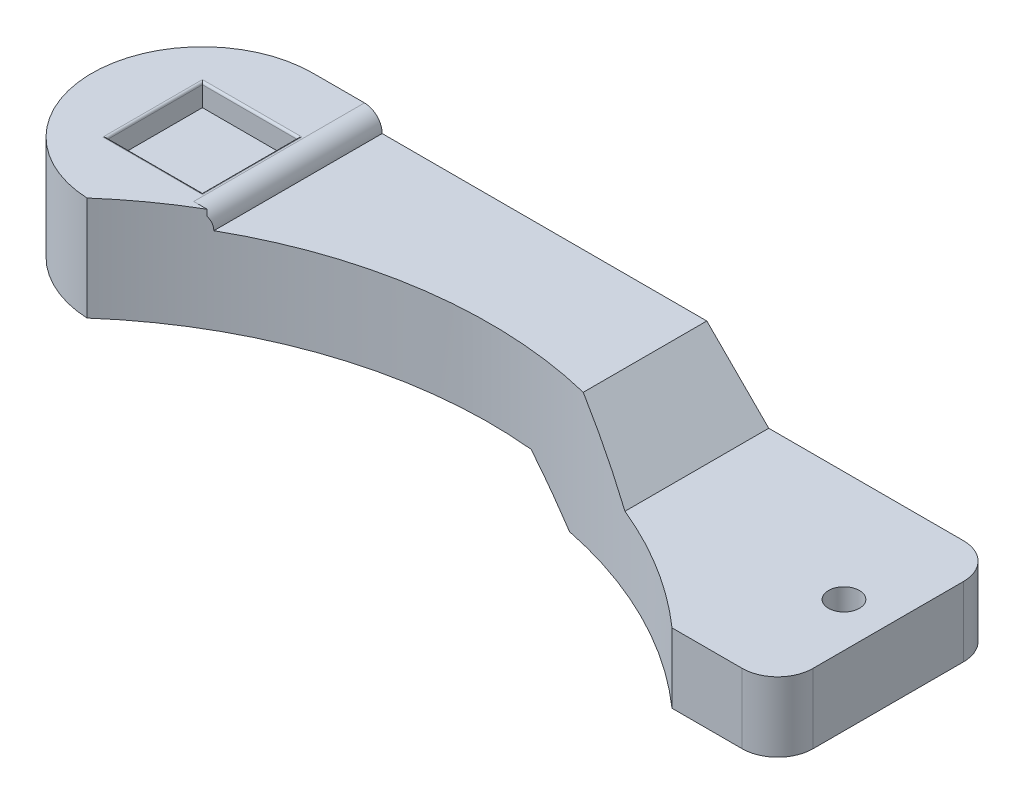
ISO-10303-21;
HEADER;
FILE_DESCRIPTION(('STEP AP214'),'2;1');
FILE_NAME('part.step','',(''),(''),'','','');
FILE_SCHEMA(('AUTOMOTIVE_DESIGN { 1 0 10303 214 1 1 1 1 }'));
ENDSEC;
DATA;
#1=APPLICATION_CONTEXT('core data for automotive mechanical design processes');
#2=APPLICATION_PROTOCOL_DEFINITION('international standard','automotive_design',2000,#1);
#3=PRODUCT_CONTEXT('',#1,'mechanical');
#4=PRODUCT('Part','Part','',(#3));
#5=PRODUCT_RELATED_PRODUCT_CATEGORY('part','',(#4));
#6=PRODUCT_DEFINITION_FORMATION('','',#4);
#7=PRODUCT_DEFINITION_CONTEXT('part definition',#1,'design');
#8=PRODUCT_DEFINITION('design','',#6,#7);
#9=PRODUCT_DEFINITION_SHAPE('','',#8);
#10=(LENGTH_UNIT() NAMED_UNIT(*) SI_UNIT(.MILLI.,.METRE.));
#11=(NAMED_UNIT(*) PLANE_ANGLE_UNIT() SI_UNIT($,.RADIAN.));
#12=(NAMED_UNIT(*) SI_UNIT($,.STERADIAN.) SOLID_ANGLE_UNIT());
#13=UNCERTAINTY_MEASURE_WITH_UNIT(LENGTH_MEASURE(1.E-05),#10,'distance_accuracy_value','');
#14=(GEOMETRIC_REPRESENTATION_CONTEXT(3) GLOBAL_UNCERTAINTY_ASSIGNED_CONTEXT((#13)) GLOBAL_UNIT_ASSIGNED_CONTEXT((#10,
#11,#12)) REPRESENTATION_CONTEXT('',''));
#15=CARTESIAN_POINT('',(0.,0.,0.));
#16=DIRECTION('',(0.,0.,1.));
#17=DIRECTION('',(1.,0.,0.));
#18=AXIS2_PLACEMENT_3D('',#15,#16,#17);
#19=CARTESIAN_POINT('',(-32.5,16.87,0.));
#20=DIRECTION('',(0.,-1.,0.));
#21=DIRECTION('',(0.,0.,-1.));
#22=AXIS2_PLACEMENT_3D('',#19,#20,#21);
#23=CYLINDRICAL_SURFACE('',#22,12.5);
#24=DIRECTION('',(0.,1.,0.));
#25=VECTOR('',#24,1.);
#26=CARTESIAN_POINT('',(-33.0577685669235,8.434994,12.4875495685003));
#27=LINE('',#26,#25);
#28=CARTESIAN_POINT('',(-33.0577685669235,16.87,12.4875495685003));
#29=VERTEX_POINT('',#28);
#30=CARTESIAN_POINT('',(-33.0577685669235,5.12,12.4875495685003));
#31=VERTEX_POINT('',#30);
#32=EDGE_CURVE('E498',#29,#31,#27,.F.);
#33=ORIENTED_EDGE('',*,*,#32,.F.);
#34=CARTESIAN_POINT('',(-32.5,16.87,0.));
#35=DIRECTION('',(0.,1.,0.));
#36=DIRECTION('',(0.,0.,1.));
#37=AXIS2_PLACEMENT_3D('',#34,#35,#36);
#38=CIRCLE('',#37,12.5);
#39=CARTESIAN_POINT('',(-32.5,16.87,-12.5));
#40=VERTEX_POINT('',#39);
#41=EDGE_CURVE('E227',#40,#29,#38,.T.);
#42=ORIENTED_EDGE('',*,*,#41,.F.);
#43=DIRECTION('',(0.,-1.,0.));
#44=VECTOR('',#43,1.);
#45=CARTESIAN_POINT('',(-32.5,16.87,-12.5));
#46=LINE('',#45,#44);
#47=CARTESIAN_POINT('',(-32.5,5.12,-12.5));
#48=VERTEX_POINT('',#47);
#49=EDGE_CURVE('E224',#48,#40,#46,.F.);
#50=ORIENTED_EDGE('',*,*,#49,.F.);
#51=CARTESIAN_POINT('',(-32.5,5.12,0.));
#52=DIRECTION('',(0.,1.,0.));
#53=DIRECTION('',(-1.,0.,0.));
#54=AXIS2_PLACEMENT_3D('',#51,#52,#53);
#55=CIRCLE('',#54,12.5);
#56=EDGE_CURVE('E229',#31,#48,#55,.F.);
#57=ORIENTED_EDGE('',*,*,#56,.F.);
#58=EDGE_LOOP('',(#33,#42,#50,#57));
#59=FACE_BOUND('',#58,.T.);
#60=ADVANCED_FACE('F39',(#59),#23,.T.);
#61=CARTESIAN_POINT('',(-45.,16.87,12.5));
#62=DIRECTION('',(0.,0.,-1.));
#63=DIRECTION('',(-1.,0.,0.));
#64=AXIS2_PLACEMENT_3D('',#61,#62,#63);
#65=PLANE('',#64);
#66=DIRECTION('',(-1.,0.,0.));
#67=VECTOR('',#66,1.);
#68=CARTESIAN_POINT('',(0.,7.87,12.5));
#69=LINE('',#68,#67);
#70=CARTESIAN_POINT('',(41.,7.87,12.5));
#71=VERTEX_POINT('',#70);
#72=CARTESIAN_POINT('',(33.0718913883074,7.87,12.5));
#73=VERTEX_POINT('',#72);
#74=EDGE_CURVE('E235',#71,#73,#69,.T.);
#75=ORIENTED_EDGE('',*,*,#74,.T.);
#76=DIRECTION('',(0.,1.,0.));
#77=VECTOR('',#76,1.);
#78=CARTESIAN_POINT('',(33.0718913883074,-1.2E-05,12.5));
#79=LINE('',#78,#77);
#80=CARTESIAN_POINT('',(33.0718913883074,0.,12.5));
#81=VERTEX_POINT('',#80);
#82=EDGE_CURVE('E194',#73,#81,#79,.F.);
#83=ORIENTED_EDGE('',*,*,#82,.T.);
#84=DIRECTION('',(1.,0.,0.));
#85=VECTOR('',#84,1.);
#86=CARTESIAN_POINT('',(-45.,0.,12.5));
#87=LINE('',#86,#85);
#88=CARTESIAN_POINT('',(41.,0.,12.5));
#89=VERTEX_POINT('',#88);
#90=EDGE_CURVE('E193',#81,#89,#87,.T.);
#91=ORIENTED_EDGE('',*,*,#90,.T.);
#92=DIRECTION('',(0.,-1.,0.));
#93=VECTOR('',#92,1.);
#94=CARTESIAN_POINT('',(41.,16.87,12.5));
#95=LINE('',#94,#93);
#96=EDGE_CURVE('E252',#89,#71,#95,.F.);
#97=ORIENTED_EDGE('',*,*,#96,.T.);
#98=EDGE_LOOP('',(#75,#83,#91,#97));
#99=FACE_BOUND('',#98,.T.);
#100=ADVANCED_FACE('F372',(#99),#65,.F.);
#101=CARTESIAN_POINT('',(45.,16.87,-12.5));
#102=DIRECTION('',(-1.,0.,0.));
#103=DIRECTION('',(0.,0.,1.));
#104=AXIS2_PLACEMENT_3D('',#101,#102,#103);
#105=PLANE('',#104);
#106=DIRECTION('',(0.,0.,-1.));
#107=VECTOR('',#106,1.);
#108=CARTESIAN_POINT('',(45.,0.,-12.5));
#109=LINE('',#108,#107);
#110=CARTESIAN_POINT('',(45.,0.,8.5));
#111=VERTEX_POINT('',#110);
#112=CARTESIAN_POINT('',(45.,0.,-8.5));
#113=VERTEX_POINT('',#112);
#114=EDGE_CURVE('E211',#111,#113,#109,.T.);
#115=ORIENTED_EDGE('',*,*,#114,.T.);
#116=DIRECTION('',(0.,-1.,0.));
#117=VECTOR('',#116,1.);
#118=CARTESIAN_POINT('',(45.,16.87,-8.5));
#119=LINE('',#118,#117);
#120=CARTESIAN_POINT('',(45.,7.87,-8.5));
#121=VERTEX_POINT('',#120);
#122=EDGE_CURVE('E246',#113,#121,#119,.F.);
#123=ORIENTED_EDGE('',*,*,#122,.T.);
#124=DIRECTION('',(0.,0.,1.));
#125=VECTOR('',#124,1.);
#126=CARTESIAN_POINT('',(45.,7.87,-21.5));
#127=LINE('',#126,#125);
#128=CARTESIAN_POINT('',(45.,7.87,8.5));
#129=VERTEX_POINT('',#128);
#130=EDGE_CURVE('E397',#121,#129,#127,.T.);
#131=ORIENTED_EDGE('',*,*,#130,.T.);
#132=DIRECTION('',(0.,-1.,0.));
#133=VECTOR('',#132,1.);
#134=CARTESIAN_POINT('',(45.,16.87,8.5));
#135=LINE('',#134,#133);
#136=EDGE_CURVE('E243',#129,#111,#135,.T.);
#137=ORIENTED_EDGE('',*,*,#136,.T.);
#138=EDGE_LOOP('',(#115,#123,#131,#137));
#139=FACE_BOUND('',#138,.T.);
#140=ADVANCED_FACE('F368',(#139),#105,.F.);
#141=CARTESIAN_POINT('',(-45.,16.87,-12.5));
#142=DIRECTION('',(0.,0.,1.));
#143=DIRECTION('',(1.,0.,0.));
#144=AXIS2_PLACEMENT_3D('',#141,#142,#143);
#145=PLANE('',#144);
#146=DIRECTION('',(-1.,0.,0.));
#147=VECTOR('',#146,1.);
#148=CARTESIAN_POINT('',(-45.,16.87,-12.5));
#149=LINE('',#148,#147);
#150=CARTESIAN_POINT('',(-26.6881108387509,16.87,-12.5));
#151=VERTEX_POINT('',#150);
#152=EDGE_CURVE('E201',#151,#40,#149,.T.);
#153=ORIENTED_EDGE('',*,*,#152,.F.);
#154=CARTESIAN_POINT('',(-26.6881108387509,14.87,-12.5));
#155=DIRECTION('',(0.,0.,1.));
#156=DIRECTION('',(1.,0.,0.));
#157=AXIS2_PLACEMENT_3D('',#154,#155,#156);
#158=CIRCLE('',#157,2.);
#159=CARTESIAN_POINT('',(-24.6881108387509,14.87,-12.5));
#160=VERTEX_POINT('',#159);
#161=EDGE_CURVE('E258',#151,#160,#158,.F.);
#162=ORIENTED_EDGE('',*,*,#161,.T.);
#163=DIRECTION('',(-1.,0.,0.));
#164=VECTOR('',#163,1.);
#165=CARTESIAN_POINT('',(-45.,14.87,-12.5));
#166=LINE('',#165,#164);
#167=CARTESIAN_POINT('',(12.,14.87,-12.5));
#168=VERTEX_POINT('',#167);
#169=EDGE_CURVE('E469',#168,#160,#166,.T.);
#170=ORIENTED_EDGE('',*,*,#169,.F.);
#171=DIRECTION('',(0.707106781186551,-0.707106781186544,0.));
#172=VECTOR('',#171,1.);
#173=CARTESIAN_POINT('',(-17.5000000000003,44.37,-12.5));
#174=LINE('',#173,#172);
#175=CARTESIAN_POINT('',(19.0000000000001,7.87,-12.5));
#176=VERTEX_POINT('',#175);
#177=EDGE_CURVE('E410',#168,#176,#174,.T.);
#178=ORIENTED_EDGE('',*,*,#177,.T.);
#179=DIRECTION('',(-1.,0.,0.));
#180=VECTOR('',#179,1.);
#181=CARTESIAN_POINT('',(-45.,7.86999999999999,-12.5));
#182=LINE('',#181,#180);
#183=CARTESIAN_POINT('',(41.,7.87,-12.5));
#184=VERTEX_POINT('',#183);
#185=EDGE_CURVE('E200',#184,#176,#182,.T.);
#186=ORIENTED_EDGE('',*,*,#185,.F.);
#187=DIRECTION('',(0.,-1.,0.));
#188=VECTOR('',#187,1.);
#189=CARTESIAN_POINT('',(41.,16.87,-12.5));
#190=LINE('',#189,#188);
#191=CARTESIAN_POINT('',(41.,0.,-12.5));
#192=VERTEX_POINT('',#191);
#193=EDGE_CURVE('E231',#184,#192,#190,.T.);
#194=ORIENTED_EDGE('',*,*,#193,.T.);
#195=DIRECTION('',(-1.,0.,0.));
#196=VECTOR('',#195,1.);
#197=CARTESIAN_POINT('',(-45.,0.,-12.5));
#198=LINE('',#197,#196);
#199=CARTESIAN_POINT('',(9.99999999999998,0.,-12.5));
#200=VERTEX_POINT('',#199);
#201=EDGE_CURVE('E205',#192,#200,#198,.T.);
#202=ORIENTED_EDGE('',*,*,#201,.T.);
#203=DIRECTION('',(-0.707106781186551,0.707106781186544,0.));
#204=VECTOR('',#203,1.);
#205=CARTESIAN_POINT('',(-25.9350000000003,35.9349999999999,-12.5));
#206=LINE('',#205,#204);
#207=CARTESIAN_POINT('',(4.87999999999994,5.12,-12.5));
#208=VERTEX_POINT('',#207);
#209=EDGE_CURVE('E199',#200,#208,#206,.T.);
#210=ORIENTED_EDGE('',*,*,#209,.T.);
#211=DIRECTION('',(-1.,0.,0.));
#212=VECTOR('',#211,1.);
#213=CARTESIAN_POINT('',(-45.,5.11999999999999,-12.5));
#214=LINE('',#213,#212);
#215=EDGE_CURVE('E203',#208,#48,#214,.T.);
#216=ORIENTED_EDGE('',*,*,#215,.T.);
#217=ORIENTED_EDGE('',*,*,#49,.T.);
#218=EDGE_LOOP('',(#153,#162,#170,#178,#186,#194,#202,#210,#216,#217));
#219=FACE_BOUND('',#218,.T.);
#220=ADVANCED_FACE('F362',(#219),#145,.F.);
#221=CARTESIAN_POINT('',(0.,16.87,0.));
#222=DIRECTION('',(0.,1.,0.));
#223=DIRECTION('',(0.,0.,1.));
#224=AXIS2_PLACEMENT_3D('',#221,#222,#223);
#225=PLANE('',#224);
#226=CARTESIAN_POINT('',(0.,16.87,50.));
#227=DIRECTION('',(0.,1.,0.));
#228=DIRECTION('',(0.,0.,1.));
#229=AXIS2_PLACEMENT_3D('',#226,#227,#228);
#230=CIRCLE('',#229,50.);
#231=CARTESIAN_POINT('',(-25.1677794209933,16.87,6.79603167513168));
#232=VERTEX_POINT('',#231);
#233=EDGE_CURVE('E506',#232,#29,#230,.T.);
#234=ORIENTED_EDGE('',*,*,#233,.F.);
#235=DIRECTION('',(1.,0.,0.));
#236=VECTOR('',#235,1.);
#237=CARTESIAN_POINT('',(-24.6881108387509,16.87,6.79603167513168));
#238=LINE('',#237,#236);
#239=CARTESIAN_POINT('',(-26.6881108387509,16.87,6.79603167513168));
#240=VERTEX_POINT('',#239);
#241=EDGE_CURVE('E289',#240,#232,#238,.T.);
#242=ORIENTED_EDGE('',*,*,#241,.F.);
#243=DIRECTION('',(0.,0.,1.));
#244=VECTOR('',#243,1.);
#245=CARTESIAN_POINT('',(-26.6881108387509,16.87,-12.5));
#246=LINE('',#245,#244);
#247=EDGE_CURVE('E256',#240,#151,#246,.F.);
#248=ORIENTED_EDGE('',*,*,#247,.T.);
#249=ORIENTED_EDGE('',*,*,#152,.T.);
#250=ORIENTED_EDGE('',*,*,#41,.T.);
#251=EDGE_LOOP('',(#234,#242,#248,#249,#250));
#252=FACE_BOUND('',#251,.T.);
#253=DIRECTION('',(1.,0.,0.));
#254=VECTOR('',#253,1.);
#255=CARTESIAN_POINT('',(-37.875,16.87,5.62500000000001));
#256=LINE('',#255,#254);
#257=CARTESIAN_POINT('',(-26.875,16.87,5.625));
#258=VERTEX_POINT('',#257);
#259=CARTESIAN_POINT('',(-38.125,16.87,5.62500000000001));
#260=VERTEX_POINT('',#259);
#261=EDGE_CURVE('E269',#258,#260,#256,.F.);
#262=ORIENTED_EDGE('',*,*,#261,.T.);
#263=DIRECTION('',(0.,0.,1.));
#264=VECTOR('',#263,1.);
#265=CARTESIAN_POINT('',(-38.125,16.87,-5.375));
#266=LINE('',#265,#264);
#267=CARTESIAN_POINT('',(-38.125,16.87,-5.625));
#268=VERTEX_POINT('',#267);
#269=EDGE_CURVE('E272',#260,#268,#266,.F.);
#270=ORIENTED_EDGE('',*,*,#269,.T.);
#271=DIRECTION('',(-1.,0.,0.));
#272=VECTOR('',#271,1.);
#273=CARTESIAN_POINT('',(-27.125,16.87,-5.625));
#274=LINE('',#273,#272);
#275=CARTESIAN_POINT('',(-26.875,16.87,-5.625));
#276=VERTEX_POINT('',#275);
#277=EDGE_CURVE('E267',#268,#276,#274,.F.);
#278=ORIENTED_EDGE('',*,*,#277,.T.);
#279=DIRECTION('',(0.,0.,-1.));
#280=VECTOR('',#279,1.);
#281=CARTESIAN_POINT('',(-26.875,16.87,5.375));
#282=LINE('',#281,#280);
#283=EDGE_CURVE('E265',#276,#258,#282,.F.);
#284=ORIENTED_EDGE('',*,*,#283,.T.);
#285=EDGE_LOOP('',(#262,#270,#278,#284));
#286=FACE_BOUND('',#285,.T.);
#287=ADVANCED_FACE('F359',(#252,#286),#225,.T.);
#288=CARTESIAN_POINT('',(0.,0.,0.));
#289=DIRECTION('',(0.,1.,0.));
#290=DIRECTION('',(0.,0.,1.));
#291=AXIS2_PLACEMENT_3D('',#288,#289,#290);
#292=PLANE('',#291);
#293=CARTESIAN_POINT('',(40.,0.,0.));
#294=DIRECTION('',(0.,-1.,0.));
#295=DIRECTION('',(0.,0.,-1.));
#296=AXIS2_PLACEMENT_3D('',#293,#294,#295);
#297=CIRCLE('',#296,1.75);
#298=CARTESIAN_POINT('',(40.,0.,-1.75));
#299=VERTEX_POINT('',#298);
#300=EDGE_CURVE('E236',#299,#299,#297,.T.);
#301=ORIENTED_EDGE('',*,*,#300,.F.);
#302=EDGE_LOOP('',(#301));
#303=FACE_BOUND('',#302,.T.);
#304=ORIENTED_EDGE('',*,*,#90,.F.);
#305=CARTESIAN_POINT('',(0.,0.,50.));
#306=DIRECTION('',(0.,1.,0.));
#307=DIRECTION('',(0.,0.,1.));
#308=AXIS2_PLACEMENT_3D('',#305,#306,#307);
#309=CIRCLE('',#308,50.);
#310=CARTESIAN_POINT('',(10.0000029767738,-2.97677381794094E-06,1.01020667289797));
#311=VERTEX_POINT('',#310);
#312=EDGE_CURVE('E178',#81,#311,#309,.T.);
#313=ORIENTED_EDGE('',*,*,#312,.T.);
#314=DIRECTION('',(0.,0.,-1.));
#315=VECTOR('',#314,1.);
#316=CARTESIAN_POINT('',(9.99999999999999,0.,0.));
#317=LINE('',#316,#315);
#318=EDGE_CURVE('E43',#311,#200,#317,.T.);
#319=ORIENTED_EDGE('',*,*,#318,.T.);
#320=ORIENTED_EDGE('',*,*,#201,.F.);
#321=CARTESIAN_POINT('',(41.,0.,-8.5));
#322=DIRECTION('',(0.,1.,0.));
#323=DIRECTION('',(0.,0.,1.));
#324=AXIS2_PLACEMENT_3D('',#321,#322,#323);
#325=CIRCLE('',#324,4.);
#326=EDGE_CURVE('E241',#192,#113,#325,.F.);
#327=ORIENTED_EDGE('',*,*,#326,.T.);
#328=ORIENTED_EDGE('',*,*,#114,.F.);
#329=CARTESIAN_POINT('',(41.,0.,8.5));
#330=DIRECTION('',(0.,1.,0.));
#331=DIRECTION('',(0.,0.,1.));
#332=AXIS2_PLACEMENT_3D('',#329,#330,#331);
#333=CIRCLE('',#332,4.);
#334=EDGE_CURVE('E239',#111,#89,#333,.F.);
#335=ORIENTED_EDGE('',*,*,#334,.T.);
#336=EDGE_LOOP('',(#304,#313,#319,#320,#327,#328,#335));
#337=FACE_BOUND('',#336,.T.);
#338=ADVANCED_FACE('F189',(#303,#337),#292,.F.);
#339=CARTESIAN_POINT('',(-37.875,14.37,-5.375));
#340=DIRECTION('',(-1.,0.,0.));
#341=DIRECTION('',(0.,0.,1.));
#342=AXIS2_PLACEMENT_3D('',#339,#340,#341);
#343=PLANE('',#342);
#344=DIRECTION('',(0.,1.,0.));
#345=VECTOR('',#344,1.);
#346=CARTESIAN_POINT('',(-37.875,14.37,-5.375));
#347=LINE('',#346,#345);
#348=CARTESIAN_POINT('',(-37.875,14.37,-5.375));
#349=VERTEX_POINT('',#348);
#350=CARTESIAN_POINT('',(-37.875,16.62,-5.375));
#351=VERTEX_POINT('',#350);
#352=EDGE_CURVE('E218',#349,#351,#347,.T.);
#353=ORIENTED_EDGE('',*,*,#352,.T.);
#354=DIRECTION('',(0.,0.,1.));
#355=VECTOR('',#354,1.);
#356=CARTESIAN_POINT('',(-37.875,16.62,5.375));
#357=LINE('',#356,#355);
#358=CARTESIAN_POINT('',(-37.875,16.62,5.375));
#359=VERTEX_POINT('',#358);
#360=EDGE_CURVE('E276',#351,#359,#357,.T.);
#361=ORIENTED_EDGE('',*,*,#360,.T.);
#362=DIRECTION('',(0.,1.,0.));
#363=VECTOR('',#362,1.);
#364=CARTESIAN_POINT('',(-37.875,14.37,5.375));
#365=LINE('',#364,#363);
#366=CARTESIAN_POINT('',(-37.875,14.37,5.375));
#367=VERTEX_POINT('',#366);
#368=EDGE_CURVE('E215',#367,#359,#365,.T.);
#369=ORIENTED_EDGE('',*,*,#368,.F.);
#370=DIRECTION('',(0.,0.,1.));
#371=VECTOR('',#370,1.);
#372=CARTESIAN_POINT('',(-37.875,14.37,-5.375));
#373=LINE('',#372,#371);
#374=EDGE_CURVE('E412',#349,#367,#373,.T.);
#375=ORIENTED_EDGE('',*,*,#374,.F.);
#376=EDGE_LOOP('',(#353,#361,#369,#375));
#377=FACE_BOUND('',#376,.T.);
#378=ADVANCED_FACE('F349',(#377),#343,.F.);
#379=CARTESIAN_POINT('',(-37.875,14.37,-5.375));
#380=DIRECTION('',(0.,0.,-1.));
#381=DIRECTION('',(-1.,0.,0.));
#382=AXIS2_PLACEMENT_3D('',#379,#380,#381);
#383=PLANE('',#382);
#384=DIRECTION('',(0.,1.,0.));
#385=VECTOR('',#384,1.);
#386=CARTESIAN_POINT('',(-27.125,14.37,-5.375));
#387=LINE('',#386,#385);
#388=CARTESIAN_POINT('',(-27.125,14.37,-5.375));
#389=VERTEX_POINT('',#388);
#390=CARTESIAN_POINT('',(-27.125,16.62,-5.375));
#391=VERTEX_POINT('',#390);
#392=EDGE_CURVE('E426',#389,#391,#387,.T.);
#393=ORIENTED_EDGE('',*,*,#392,.T.);
#394=DIRECTION('',(-1.,0.,0.));
#395=VECTOR('',#394,1.);
#396=CARTESIAN_POINT('',(-37.875,16.62,-5.375));
#397=LINE('',#396,#395);
#398=EDGE_CURVE('E274',#391,#351,#397,.T.);
#399=ORIENTED_EDGE('',*,*,#398,.T.);
#400=ORIENTED_EDGE('',*,*,#352,.F.);
#401=DIRECTION('',(-1.,0.,0.));
#402=VECTOR('',#401,1.);
#403=CARTESIAN_POINT('',(-37.875,14.37,-5.375));
#404=LINE('',#403,#402);
#405=EDGE_CURVE('E421',#389,#349,#404,.T.);
#406=ORIENTED_EDGE('',*,*,#405,.F.);
#407=EDGE_LOOP('',(#393,#399,#400,#406));
#408=FACE_BOUND('',#407,.T.);
#409=ADVANCED_FACE('F345',(#408),#383,.F.);
#410=CARTESIAN_POINT('',(-27.125,14.37,-5.375));
#411=DIRECTION('',(1.,0.,0.));
#412=DIRECTION('',(0.,0.,-1.));
#413=AXIS2_PLACEMENT_3D('',#410,#411,#412);
#414=PLANE('',#413);
#415=DIRECTION('',(0.,1.,0.));
#416=VECTOR('',#415,1.);
#417=CARTESIAN_POINT('',(-27.125,14.37,5.375));
#418=LINE('',#417,#416);
#419=CARTESIAN_POINT('',(-27.125,14.37,5.375));
#420=VERTEX_POINT('',#419);
#421=CARTESIAN_POINT('',(-27.125,16.62,5.375));
#422=VERTEX_POINT('',#421);
#423=EDGE_CURVE('E427',#420,#422,#418,.T.);
#424=ORIENTED_EDGE('',*,*,#423,.T.);
#425=DIRECTION('',(0.,0.,-1.));
#426=VECTOR('',#425,1.);
#427=CARTESIAN_POINT('',(-27.125,16.62,-5.375));
#428=LINE('',#427,#426);
#429=EDGE_CURVE('E49',#422,#391,#428,.T.);
#430=ORIENTED_EDGE('',*,*,#429,.T.);
#431=ORIENTED_EDGE('',*,*,#392,.F.);
#432=DIRECTION('',(0.,0.,-1.));
#433=VECTOR('',#432,1.);
#434=CARTESIAN_POINT('',(-27.125,14.37,-5.375));
#435=LINE('',#434,#433);
#436=EDGE_CURVE('E418',#420,#389,#435,.T.);
#437=ORIENTED_EDGE('',*,*,#436,.F.);
#438=EDGE_LOOP('',(#424,#430,#431,#437));
#439=FACE_BOUND('',#438,.T.);
#440=ADVANCED_FACE('F348',(#439),#414,.F.);
#441=CARTESIAN_POINT('',(-37.875,14.37,5.375));
#442=DIRECTION('',(0.,0.,1.));
#443=DIRECTION('',(1.,0.,0.));
#444=AXIS2_PLACEMENT_3D('',#441,#442,#443);
#445=PLANE('',#444);
#446=ORIENTED_EDGE('',*,*,#368,.T.);
#447=DIRECTION('',(1.,0.,0.));
#448=VECTOR('',#447,1.);
#449=CARTESIAN_POINT('',(-27.125,16.62,5.375));
#450=LINE('',#449,#448);
#451=EDGE_CURVE('E262',#359,#422,#450,.T.);
#452=ORIENTED_EDGE('',*,*,#451,.T.);
#453=ORIENTED_EDGE('',*,*,#423,.F.);
#454=DIRECTION('',(1.,0.,0.));
#455=VECTOR('',#454,1.);
#456=CARTESIAN_POINT('',(-37.875,14.37,5.375));
#457=LINE('',#456,#455);
#458=EDGE_CURVE('E415',#367,#420,#457,.T.);
#459=ORIENTED_EDGE('',*,*,#458,.F.);
#460=EDGE_LOOP('',(#446,#452,#453,#459));
#461=FACE_BOUND('',#460,.T.);
#462=ADVANCED_FACE('F343',(#461),#445,.F.);
#463=CARTESIAN_POINT('',(0.,14.37,0.));
#464=DIRECTION('',(0.,1.,0.));
#465=DIRECTION('',(0.,0.,1.));
#466=AXIS2_PLACEMENT_3D('',#463,#464,#465);
#467=PLANE('',#466);
#468=ORIENTED_EDGE('',*,*,#374,.T.);
#469=ORIENTED_EDGE('',*,*,#458,.T.);
#470=ORIENTED_EDGE('',*,*,#436,.T.);
#471=ORIENTED_EDGE('',*,*,#405,.T.);
#472=EDGE_LOOP('',(#468,#469,#470,#471));
#473=FACE_BOUND('',#472,.T.);
#474=ADVANCED_FACE('F330',(#473),#467,.T.);
#475=CARTESIAN_POINT('',(0.,5.12,-21.5));
#476=DIRECTION('',(0.,1.,0.));
#477=DIRECTION('',(-1.,0.,0.));
#478=AXIS2_PLACEMENT_3D('',#475,#476,#477);
#479=PLANE('',#478);
#480=CARTESIAN_POINT('',(-32.5,5.11999999999999,0.));
#481=DIRECTION('',(0.,-1.,0.));
#482=DIRECTION('',(1.,0.,0.));
#483=AXIS2_PLACEMENT_3D('',#480,#481,#482);
#484=CIRCLE('',#483,6.45);
#485=CARTESIAN_POINT('',(-26.05,5.11999999999999,0.));
#486=VERTEX_POINT('',#485);
#487=EDGE_CURVE('E475',#486,#486,#484,.T.);
#488=ORIENTED_EDGE('',*,*,#487,.F.);
#489=EDGE_LOOP('',(#488));
#490=FACE_BOUND('',#489,.T.);
#491=DIRECTION('',(0.,0.,1.));
#492=VECTOR('',#491,1.);
#493=CARTESIAN_POINT('',(4.87999999999994,5.12,-21.5));
#494=LINE('',#493,#492);
#495=CARTESIAN_POINT('',(4.87999999999994,5.12,0.238713842988323));
#496=VERTEX_POINT('',#495);
#497=EDGE_CURVE('E405',#208,#496,#494,.T.);
#498=ORIENTED_EDGE('',*,*,#497,.T.);
#499=CARTESIAN_POINT('',(0.,5.12,50.));
#500=DIRECTION('',(0.,1.,0.));
#501=DIRECTION('',(-1.,0.,0.));
#502=AXIS2_PLACEMENT_3D('',#499,#500,#501);
#503=CIRCLE('',#502,50.);
#504=EDGE_CURVE('E181',#496,#31,#503,.T.);
#505=ORIENTED_EDGE('',*,*,#504,.T.);
#506=ORIENTED_EDGE('',*,*,#56,.T.);
#507=ORIENTED_EDGE('',*,*,#215,.F.);
#508=EDGE_LOOP('',(#498,#505,#506,#507));
#509=FACE_BOUND('',#508,.T.);
#510=ADVANCED_FACE('F327',(#490,#509),#479,.F.);
#511=CARTESIAN_POINT('',(4.99999999999994,5.,-21.5));
#512=DIRECTION('',(0.707106781186544,0.707106781186551,0.));
#513=DIRECTION('',(-0.707106781186551,0.707106781186544,0.));
#514=AXIS2_PLACEMENT_3D('',#511,#512,#513);
#515=PLANE('',#514);
#516=ORIENTED_EDGE('',*,*,#318,.F.);
#517=CARTESIAN_POINT('',(0.,9.99999999999989,50.));
#518=DIRECTION('',(0.707106781186544,0.707106781186551,0.));
#519=DIRECTION('',(-0.707106781186551,0.707106781186544,0.));
#520=AXIS2_PLACEMENT_3D('',#517,#518,#519);
#521=ELLIPSE('',#520,70.7106781186544,50.);
#522=EDGE_CURVE('E175',#311,#496,#521,.T.);
#523=ORIENTED_EDGE('',*,*,#522,.T.);
#524=ORIENTED_EDGE('',*,*,#497,.F.);
#525=ORIENTED_EDGE('',*,*,#209,.F.);
#526=EDGE_LOOP('',(#516,#523,#524,#525));
#527=FACE_BOUND('',#526,.T.);
#528=ADVANCED_FACE('F197',(#527),#515,.F.);
#529=CARTESIAN_POINT('',(0.,7.87,-21.5));
#530=DIRECTION('',(0.,1.,0.));
#531=DIRECTION('',(-1.,0.,0.));
#532=AXIS2_PLACEMENT_3D('',#529,#530,#531);
#533=PLANE('',#532);
#534=CARTESIAN_POINT('',(0.,7.87,50.));
#535=DIRECTION('',(0.,1.,0.));
#536=DIRECTION('',(-1.,0.,0.));
#537=AXIS2_PLACEMENT_3D('',#534,#535,#536);
#538=CIRCLE('',#537,50.);
#539=CARTESIAN_POINT('',(19.0000000000001,7.87,3.75067568061134));
#540=VERTEX_POINT('',#539);
#541=EDGE_CURVE('E488',#73,#540,#538,.T.);
#542=ORIENTED_EDGE('',*,*,#541,.F.);
#543=ORIENTED_EDGE('',*,*,#74,.F.);
#544=CARTESIAN_POINT('',(41.,7.87,8.5));
#545=DIRECTION('',(0.,1.,0.));
#546=DIRECTION('',(-1.,0.,0.));
#547=AXIS2_PLACEMENT_3D('',#544,#545,#546);
#548=CIRCLE('',#547,4.);
#549=EDGE_CURVE('E248',#71,#129,#548,.T.);
#550=ORIENTED_EDGE('',*,*,#549,.T.);
#551=ORIENTED_EDGE('',*,*,#130,.F.);
#552=CARTESIAN_POINT('',(41.,7.87,-8.5));
#553=DIRECTION('',(0.,1.,0.));
#554=DIRECTION('',(-1.,0.,0.));
#555=AXIS2_PLACEMENT_3D('',#552,#553,#554);
#556=CIRCLE('',#555,4.);
#557=EDGE_CURVE('E250',#121,#184,#556,.T.);
#558=ORIENTED_EDGE('',*,*,#557,.T.);
#559=ORIENTED_EDGE('',*,*,#185,.T.);
#560=DIRECTION('',(0.,0.,1.));
#561=VECTOR('',#560,1.);
#562=CARTESIAN_POINT('',(19.0000000000001,7.87,-21.5));
#563=LINE('',#562,#561);
#564=EDGE_CURVE('E402',#176,#540,#563,.T.);
#565=ORIENTED_EDGE('',*,*,#564,.T.);
#566=EDGE_LOOP('',(#542,#543,#550,#551,#558,#559,#565));
#567=FACE_BOUND('',#566,.T.);
#568=CARTESIAN_POINT('',(40.,7.87,0.));
#569=DIRECTION('',(0.,1.,0.));
#570=DIRECTION('',(-1.,0.,0.));
#571=AXIS2_PLACEMENT_3D('',#568,#569,#570);
#572=CIRCLE('',#571,1.75);
#573=CARTESIAN_POINT('',(38.25,7.87,0.));
#574=VERTEX_POINT('',#573);
#575=EDGE_CURVE('E232',#574,#574,#572,.T.);
#576=ORIENTED_EDGE('',*,*,#575,.F.);
#577=EDGE_LOOP('',(#576));
#578=FACE_BOUND('',#577,.T.);
#579=ADVANCED_FACE('F334',(#567,#578),#533,.T.);
#580=CARTESIAN_POINT('',(13.4349999999999,13.4350000000001,-21.5));
#581=DIRECTION('',(-0.707106781186544,-0.707106781186552,0.));
#582=DIRECTION('',(0.707106781186551,-0.707106781186544,0.));
#583=AXIS2_PLACEMENT_3D('',#580,#581,#582);
#584=PLANE('',#583);
#585=DIRECTION('',(0.,0.,-1.));
#586=VECTOR('',#585,1.);
#587=CARTESIAN_POINT('',(12.,14.87,-21.5));
#588=LINE('',#587,#586);
#589=CARTESIAN_POINT('',(12.,14.87,1.46135560195362));
#590=VERTEX_POINT('',#589);
#591=EDGE_CURVE('E254',#590,#168,#588,.T.);
#592=ORIENTED_EDGE('',*,*,#591,.F.);
#593=CARTESIAN_POINT('',(0.,26.8699999999999,50.));
#594=DIRECTION('',(-0.707106781186544,-0.707106781186552,0.));
#595=DIRECTION('',(-0.707106781186551,0.707106781186544,0.));
#596=AXIS2_PLACEMENT_3D('',#593,#594,#595);
#597=ELLIPSE('',#596,70.7106781186544,50.);
#598=EDGE_CURVE('E487',#590,#540,#597,.T.);
#599=ORIENTED_EDGE('',*,*,#598,.T.);
#600=ORIENTED_EDGE('',*,*,#564,.F.);
#601=ORIENTED_EDGE('',*,*,#177,.F.);
#602=EDGE_LOOP('',(#592,#599,#600,#601));
#603=FACE_BOUND('',#602,.T.);
#604=ADVANCED_FACE('F325',(#603),#584,.F.);
#605=CARTESIAN_POINT('',(40.,16.87,0.));
#606=DIRECTION('',(0.,-1.,0.));
#607=DIRECTION('',(0.,0.,-1.));
#608=AXIS2_PLACEMENT_3D('',#605,#606,#607);
#609=CYLINDRICAL_SURFACE('',#608,1.75);
#610=ORIENTED_EDGE('',*,*,#575,.T.);
#611=EDGE_LOOP('',(#610));
#612=FACE_BOUND('',#611,.T.);
#613=ORIENTED_EDGE('',*,*,#300,.T.);
#614=EDGE_LOOP('',(#613));
#615=FACE_BOUND('',#614,.T.);
#616=ADVANCED_FACE('F321',(#612,#615),#609,.F.);
#617=CARTESIAN_POINT('',(41.,16.87,-8.5));
#618=DIRECTION('',(0.,-1.,0.));
#619=DIRECTION('',(0.,0.,-1.));
#620=AXIS2_PLACEMENT_3D('',#617,#618,#619);
#621=CYLINDRICAL_SURFACE('',#620,4.);
#622=ORIENTED_EDGE('',*,*,#557,.F.);
#623=ORIENTED_EDGE('',*,*,#122,.F.);
#624=ORIENTED_EDGE('',*,*,#326,.F.);
#625=ORIENTED_EDGE('',*,*,#193,.F.);
#626=EDGE_LOOP('',(#622,#623,#624,#625));
#627=FACE_BOUND('',#626,.T.);
#628=ADVANCED_FACE('F324',(#627),#621,.T.);
#629=CARTESIAN_POINT('',(41.,16.87,8.5));
#630=DIRECTION('',(0.,-1.,0.));
#631=DIRECTION('',(0.,0.,-1.));
#632=AXIS2_PLACEMENT_3D('',#629,#630,#631);
#633=CYLINDRICAL_SURFACE('',#632,4.);
#634=ORIENTED_EDGE('',*,*,#549,.F.);
#635=ORIENTED_EDGE('',*,*,#96,.F.);
#636=ORIENTED_EDGE('',*,*,#334,.F.);
#637=ORIENTED_EDGE('',*,*,#136,.F.);
#638=EDGE_LOOP('',(#634,#635,#636,#637));
#639=FACE_BOUND('',#638,.T.);
#640=ADVANCED_FACE('F319',(#639),#633,.T.);
#641=CARTESIAN_POINT('',(-24.6881108387509,14.87,6.79603167513168));
#642=DIRECTION('',(0.,0.,1.));
#643=DIRECTION('',(1.,0.,0.));
#644=AXIS2_PLACEMENT_3D('',#641,#642,#643);
#645=PLANE('',#644);
#646=ORIENTED_EDGE('',*,*,#241,.T.);
#647=DIRECTION('',(0.,1.,0.));
#648=VECTOR('',#647,1.);
#649=CARTESIAN_POINT('',(-25.1677794209933,-1.2E-05,6.79603167513168));
#650=LINE('',#649,#648);
#651=CARTESIAN_POINT('',(-25.1677794209933,16.1694584949813,6.79603167513168));
#652=VERTEX_POINT('',#651);
#653=EDGE_CURVE('E510',#232,#652,#650,.F.);
#654=ORIENTED_EDGE('',*,*,#653,.T.);
#655=CARTESIAN_POINT('',(-26.6881108387509,14.87,6.79603167513168));
#656=DIRECTION('',(0.,0.,1.));
#657=DIRECTION('',(1.,0.,0.));
#658=AXIS2_PLACEMENT_3D('',#655,#656,#657);
#659=CIRCLE('',#658,2.);
#660=EDGE_CURVE('E260',#652,#240,#659,.T.);
#661=ORIENTED_EDGE('',*,*,#660,.T.);
#662=EDGE_LOOP('',(#646,#654,#661));
#663=FACE_BOUND('',#662,.T.);
#664=ADVANCED_FACE('F315',(#663),#645,.F.);
#665=CARTESIAN_POINT('',(0.,14.87,0.));
#666=DIRECTION('',(0.,1.,0.));
#667=DIRECTION('',(0.,0.,1.));
#668=AXIS2_PLACEMENT_3D('',#665,#666,#667);
#669=PLANE('',#668);
#670=CARTESIAN_POINT('',(0.,14.87,50.));
#671=DIRECTION('',(0.,1.,0.));
#672=DIRECTION('',(0.,0.,1.));
#673=AXIS2_PLACEMENT_3D('',#670,#671,#672);
#674=CIRCLE('',#673,50.);
#675=CARTESIAN_POINT('',(-24.6881108387509,14.87,6.52015198723035));
#676=VERTEX_POINT('',#675);
#677=EDGE_CURVE('E55',#590,#676,#674,.T.);
#678=ORIENTED_EDGE('',*,*,#677,.F.);
#679=ORIENTED_EDGE('',*,*,#591,.T.);
#680=ORIENTED_EDGE('',*,*,#169,.T.);
#681=DIRECTION('',(0.,0.,1.));
#682=VECTOR('',#681,1.);
#683=CARTESIAN_POINT('',(-24.6881108387509,14.87,-14.1475520096478));
#684=LINE('',#683,#682);
#685=EDGE_CURVE('E463',#160,#676,#684,.T.);
#686=ORIENTED_EDGE('',*,*,#685,.T.);
#687=EDGE_LOOP('',(#678,#679,#680,#686));
#688=FACE_BOUND('',#687,.T.);
#689=ADVANCED_FACE('F312',(#688),#669,.T.);
#690=CARTESIAN_POINT('',(-26.6881108387509,14.87,-14.1475520096478));
#691=DIRECTION('',(0.,0.,-1.));
#692=DIRECTION('',(-1.,0.,0.));
#693=AXIS2_PLACEMENT_3D('',#690,#691,#692);
#694=CYLINDRICAL_SURFACE('',#693,2.);
#695=CARTESIAN_POINT('',(-24.6881108387509,14.87,6.52015198723035));
#696=CARTESIAN_POINT('',(-24.6881022582284,14.9208604073316,6.5201478253592));
#697=CARTESIAN_POINT('',(-24.6900506877215,14.9717162575252,6.52125346158089));
#698=CARTESIAN_POINT('',(-24.6977963104584,15.0730253091269,6.52565246527626));
#699=CARTESIAN_POINT('',(-24.7035924527248,15.1234786166797,6.52894523534878));
#700=CARTESIAN_POINT('',(-24.7189427889502,15.2234510218283,6.53767216444271));
#701=CARTESIAN_POINT('',(-24.7284844434981,15.272972664694,6.54309917844675));
#702=CARTESIAN_POINT('',(-24.7511955152222,15.3708871882977,6.55603045085194));
#703=CARTESIAN_POINT('',(-24.7643649588751,15.4192800607948,6.56353472441355));
#704=CARTESIAN_POINT('',(-24.8090705085082,15.5622023793737,6.58904272262548));
#705=CARTESIAN_POINT('',(-24.8458274377456,15.6546258035824,6.61005497507907));
#706=CARTESIAN_POINT('',(-24.931606112352,15.8314337630275,6.65928660948335));
#707=CARTESIAN_POINT('',(-24.9806254443167,15.9158198756068,6.68750457327674));
#708=CARTESIAN_POINT('',(-25.0555199129873,16.0258600886294,6.73082507907152));
#709=CARTESIAN_POINT('',(-25.0770278994901,16.0556439939839,6.74328570587072));
#710=CARTESIAN_POINT('',(-25.1214013136076,16.1136841173924,6.76904057942156));
#711=CARTESIAN_POINT('',(-25.144263459719,16.141943735075,6.78233281502847));
#712=CARTESIAN_POINT('',(-25.1677794209933,16.1694584949814,6.79603167513167));
#713=B_SPLINE_CURVE_WITH_KNOTS('',3,(#695,#696,#697,#698,#699,#700,#701,#702,#703,#704,#705,
#706,#707,#708,#709,#710,#711,#712),.UNSPECIFIED.,.F.,.F.,(4,2,2,2,2,2,2,2,4),(0.,
0.152524276327103,0.305006908777803,0.456983347396509,0.608960895213921,0.912463785033733,
1.21590698837184,1.33223955946618,1.448300923977),.UNSPECIFIED.);
#714=EDGE_CURVE('E11',#676,#652,#713,.T.);
#715=ORIENTED_EDGE('',*,*,#714,.F.);
#716=ORIENTED_EDGE('',*,*,#685,.F.);
#717=ORIENTED_EDGE('',*,*,#161,.F.);
#718=ORIENTED_EDGE('',*,*,#247,.F.);
#719=ORIENTED_EDGE('',*,*,#660,.F.);
#720=EDGE_LOOP('',(#715,#716,#717,#718,#719));
#721=FACE_BOUND('',#720,.T.);
#722=ADVANCED_FACE('F296',(#721),#694,.T.);
#723=CARTESIAN_POINT('',(-37.875,16.62,-5.625));
#724=DIRECTION('',(1.,0.,0.));
#725=DIRECTION('',(0.,0.,-1.));
#726=AXIS2_PLACEMENT_3D('',#723,#724,#725);
#727=CYLINDRICAL_SURFACE('',#726,0.25);
#728=CARTESIAN_POINT('',(-26.875,16.62,-5.625));
#729=DIRECTION('',(0.707106781186548,0.,0.707106781186547));
#730=DIRECTION('',(0.707106781186547,0.,-0.707106781186548));
#731=AXIS2_PLACEMENT_3D('',#728,#729,#730);
#732=ELLIPSE('',#731,0.353553390593274,0.25);
#733=EDGE_CURVE('E284',#276,#391,#732,.T.);
#734=ORIENTED_EDGE('',*,*,#733,.F.);
#735=ORIENTED_EDGE('',*,*,#277,.F.);
#736=CARTESIAN_POINT('',(-38.125,16.62,-5.625));
#737=DIRECTION('',(0.707106781186547,0.,-0.707106781186548));
#738=DIRECTION('',(0.707106781186548,0.,0.707106781186547));
#739=AXIS2_PLACEMENT_3D('',#736,#737,#738);
#740=ELLIPSE('',#739,0.353553390593274,0.25);
#741=EDGE_CURVE('E287',#351,#268,#740,.F.);
#742=ORIENTED_EDGE('',*,*,#741,.F.);
#743=ORIENTED_EDGE('',*,*,#398,.F.);
#744=EDGE_LOOP('',(#734,#735,#742,#743));
#745=FACE_BOUND('',#744,.T.);
#746=ADVANCED_FACE('F41',(#745),#727,.T.);
#747=CARTESIAN_POINT('',(-38.125,16.62,-5.375));
#748=DIRECTION('',(0.,0.,-1.));
#749=DIRECTION('',(-1.,0.,0.));
#750=AXIS2_PLACEMENT_3D('',#747,#748,#749);
#751=CYLINDRICAL_SURFACE('',#750,0.25);
#752=ORIENTED_EDGE('',*,*,#741,.T.);
#753=ORIENTED_EDGE('',*,*,#269,.F.);
#754=CARTESIAN_POINT('',(-38.125,16.62,5.62500000000001));
#755=DIRECTION('',(-0.707106781186548,0.,-0.707106781186547));
#756=DIRECTION('',(-0.707106781186547,0.,0.707106781186548));
#757=AXIS2_PLACEMENT_3D('',#754,#755,#756);
#758=ELLIPSE('',#757,0.353553390593274,0.25);
#759=EDGE_CURVE('E281',#359,#260,#758,.F.);
#760=ORIENTED_EDGE('',*,*,#759,.F.);
#761=ORIENTED_EDGE('',*,*,#360,.F.);
#762=EDGE_LOOP('',(#752,#753,#760,#761));
#763=FACE_BOUND('',#762,.T.);
#764=ADVANCED_FACE('F437',(#763),#751,.T.);
#765=CARTESIAN_POINT('',(-26.875,16.62,-5.375));
#766=DIRECTION('',(0.,0.,1.));
#767=DIRECTION('',(1.,0.,0.));
#768=AXIS2_PLACEMENT_3D('',#765,#766,#767);
#769=CYLINDRICAL_SURFACE('',#768,0.25);
#770=ORIENTED_EDGE('',*,*,#733,.T.);
#771=ORIENTED_EDGE('',*,*,#429,.F.);
#772=CARTESIAN_POINT('',(-26.875,16.62,5.625));
#773=DIRECTION('',(-0.707106781186547,0.,0.707106781186548));
#774=DIRECTION('',(-0.707106781186548,0.,-0.707106781186547));
#775=AXIS2_PLACEMENT_3D('',#772,#773,#774);
#776=ELLIPSE('',#775,0.353553390593274,0.25);
#777=EDGE_CURVE('E279',#258,#422,#776,.T.);
#778=ORIENTED_EDGE('',*,*,#777,.F.);
#779=ORIENTED_EDGE('',*,*,#283,.F.);
#780=EDGE_LOOP('',(#770,#771,#778,#779));
#781=FACE_BOUND('',#780,.T.);
#782=ADVANCED_FACE('F443',(#781),#769,.T.);
#783=CARTESIAN_POINT('',(-37.875,16.62,5.62500000000001));
#784=DIRECTION('',(-1.,0.,0.));
#785=DIRECTION('',(0.,0.,1.));
#786=AXIS2_PLACEMENT_3D('',#783,#784,#785);
#787=CYLINDRICAL_SURFACE('',#786,0.25);
#788=ORIENTED_EDGE('',*,*,#759,.T.);
#789=ORIENTED_EDGE('',*,*,#261,.F.);
#790=ORIENTED_EDGE('',*,*,#777,.T.);
#791=ORIENTED_EDGE('',*,*,#451,.F.);
#792=EDGE_LOOP('',(#788,#789,#790,#791));
#793=FACE_BOUND('',#792,.T.);
#794=ADVANCED_FACE('F310',(#793),#787,.T.);
#795=CARTESIAN_POINT('',(-32.5,8.72,0.));
#796=DIRECTION('',(0.,-1.,0.));
#797=DIRECTION('',(1.,0.,0.));
#798=AXIS2_PLACEMENT_3D('',#795,#796,#797);
#799=CYLINDRICAL_SURFACE('',#798,6.45);
#800=CARTESIAN_POINT('',(-32.5,8.72,0.));
#801=DIRECTION('',(0.,-1.,0.));
#802=DIRECTION('',(1.,0.,0.));
#803=AXIS2_PLACEMENT_3D('',#800,#801,#802);
#804=CIRCLE('',#803,6.45);
#805=CARTESIAN_POINT('',(-26.05,8.72,0.));
#806=VERTEX_POINT('',#805);
#807=EDGE_CURVE('E282',#806,#806,#804,.T.);
#808=ORIENTED_EDGE('',*,*,#807,.F.);
#809=EDGE_LOOP('',(#808));
#810=FACE_BOUND('',#809,.T.);
#811=ORIENTED_EDGE('',*,*,#487,.T.);
#812=EDGE_LOOP('',(#811));
#813=FACE_BOUND('',#812,.T.);
#814=ADVANCED_FACE('F306',(#810,#813),#799,.F.);
#815=CARTESIAN_POINT('',(-32.5,8.72,0.));
#816=DIRECTION('',(0.,-1.,0.));
#817=DIRECTION('',(1.,0.,0.));
#818=AXIS2_PLACEMENT_3D('',#815,#816,#817);
#819=PLANE('',#818);
#820=ORIENTED_EDGE('',*,*,#807,.T.);
#821=EDGE_LOOP('',(#820));
#822=FACE_BOUND('',#821,.T.);
#823=ADVANCED_FACE('F303',(#822),#819,.T.);
#824=CARTESIAN_POINT('',(0.,-1.2E-05,50.));
#825=DIRECTION('',(0.,1.,0.));
#826=DIRECTION('',(0.,0.,1.));
#827=AXIS2_PLACEMENT_3D('',#824,#825,#826);
#828=CYLINDRICAL_SURFACE('',#827,50.);
#829=ORIENTED_EDGE('',*,*,#32,.T.);
#830=ORIENTED_EDGE('',*,*,#504,.F.);
#831=ORIENTED_EDGE('',*,*,#522,.F.);
#832=ORIENTED_EDGE('',*,*,#312,.F.);
#833=ORIENTED_EDGE('',*,*,#82,.F.);
#834=ORIENTED_EDGE('',*,*,#541,.T.);
#835=ORIENTED_EDGE('',*,*,#598,.F.);
#836=ORIENTED_EDGE('',*,*,#677,.T.);
#837=ORIENTED_EDGE('',*,*,#714,.T.);
#838=ORIENTED_EDGE('',*,*,#653,.F.);
#839=ORIENTED_EDGE('',*,*,#233,.T.);
#840=EDGE_LOOP('',(#829,#830,#831,#832,#833,#834,#835,#836,#837,#838,#839));
#841=FACE_BOUND('',#840,.T.);
#842=ADVANCED_FACE('F177',(#841),#828,.F.);
#843=CLOSED_SHELL('',(#60,#100,#140,#220,#287,#338,#378,#409,#440,#462,#474,#510,#528,#579,#604,
#616,#628,#640,#664,#689,#722,#746,#764,#782,#794,#814,#823,#842));
#844=MANIFOLD_SOLID_BREP('B2',#843);
#845=ADVANCED_BREP_SHAPE_REPRESENTATION('',(#18,#844),#14);
#846=SHAPE_DEFINITION_REPRESENTATION(#9,#845);
ENDSEC;
END-ISO-10303-21;
